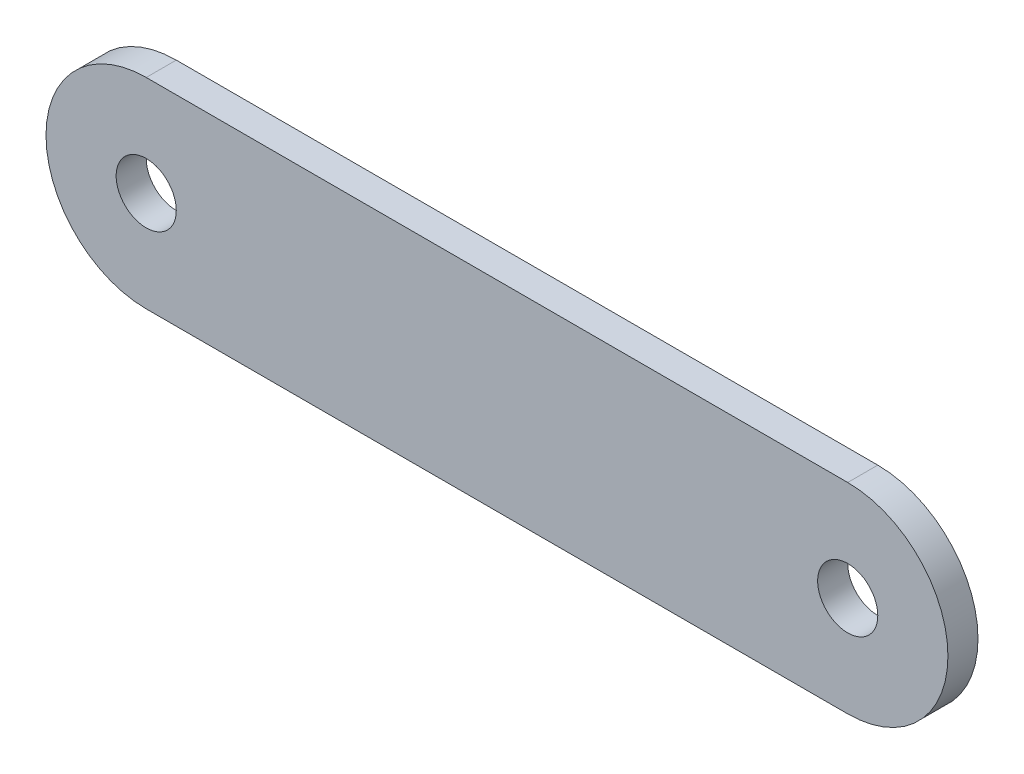
ISO-10303-21;
HEADER;
FILE_DESCRIPTION(('STEP AP214'),'2;1');
FILE_NAME('part.step','',(''),(''),'','','');
FILE_SCHEMA(('AUTOMOTIVE_DESIGN { 1 0 10303 214 1 1 1 1 }'));
ENDSEC;
DATA;
#1=APPLICATION_CONTEXT('core data for automotive mechanical design processes');
#2=APPLICATION_PROTOCOL_DEFINITION('international standard','automotive_design',2000,#1);
#3=PRODUCT_CONTEXT('',#1,'mechanical');
#4=PRODUCT('Part','Part','',(#3));
#5=PRODUCT_RELATED_PRODUCT_CATEGORY('part','',(#4));
#6=PRODUCT_DEFINITION_FORMATION('','',#4);
#7=PRODUCT_DEFINITION_CONTEXT('part definition',#1,'design');
#8=PRODUCT_DEFINITION('design','',#6,#7);
#9=PRODUCT_DEFINITION_SHAPE('','',#8);
#10=(LENGTH_UNIT() NAMED_UNIT(*) SI_UNIT(.MILLI.,.METRE.));
#11=(NAMED_UNIT(*) PLANE_ANGLE_UNIT() SI_UNIT($,.RADIAN.));
#12=(NAMED_UNIT(*) SI_UNIT($,.STERADIAN.) SOLID_ANGLE_UNIT());
#13=UNCERTAINTY_MEASURE_WITH_UNIT(LENGTH_MEASURE(1.E-05),#10,'distance_accuracy_value','');
#14=(GEOMETRIC_REPRESENTATION_CONTEXT(3) GLOBAL_UNCERTAINTY_ASSIGNED_CONTEXT((#13)) GLOBAL_UNIT_ASSIGNED_CONTEXT((#10,
#11,#12)) REPRESENTATION_CONTEXT('',''));
#15=CARTESIAN_POINT('',(0.,0.,0.));
#16=DIRECTION('',(0.,0.,1.));
#17=DIRECTION('',(1.,0.,0.));
#18=AXIS2_PLACEMENT_3D('',#15,#16,#17);
#19=CARTESIAN_POINT('',(0.,0.,3.));
#20=DIRECTION('',(0.,0.,1.));
#21=DIRECTION('',(1.,0.,0.));
#22=AXIS2_PLACEMENT_3D('',#19,#20,#21);
#23=PLANE('',#22);
#24=CARTESIAN_POINT('',(0.,0.,3.));
#25=DIRECTION('',(0.,0.,1.));
#26=DIRECTION('',(1.,0.,0.));
#27=AXIS2_PLACEMENT_3D('',#24,#25,#26);
#28=CIRCLE('',#27,3.);
#29=CARTESIAN_POINT('',(3.,0.,3.));
#30=VERTEX_POINT('',#29);
#31=EDGE_CURVE('E112',#30,#30,#28,.T.);
#32=ORIENTED_EDGE('',*,*,#31,.F.);
#33=EDGE_LOOP('',(#32));
#34=FACE_BOUND('',#33,.T.);
#35=CARTESIAN_POINT('',(0.,0.,3.));
#36=DIRECTION('',(0.,0.,1.));
#37=DIRECTION('',(1.,0.,0.));
#38=AXIS2_PLACEMENT_3D('',#35,#36,#37);
#39=CIRCLE('',#38,10.);
#40=CARTESIAN_POINT('',(0.,10.,3.));
#41=VERTEX_POINT('',#40);
#42=CARTESIAN_POINT('',(0.,-10.,3.));
#43=VERTEX_POINT('',#42);
#44=EDGE_CURVE('E92',#41,#43,#39,.T.);
#45=ORIENTED_EDGE('',*,*,#44,.T.);
#46=DIRECTION('',(1.,0.,0.));
#47=VECTOR('',#46,1.);
#48=CARTESIAN_POINT('',(0.,-10.,3.));
#49=LINE('',#48,#47);
#50=CARTESIAN_POINT('',(70.,-10.,3.));
#51=VERTEX_POINT('',#50);
#52=EDGE_CURVE('E87',#43,#51,#49,.T.);
#53=ORIENTED_EDGE('',*,*,#52,.T.);
#54=CARTESIAN_POINT('',(70.,0.,3.));
#55=DIRECTION('',(0.,0.,1.));
#56=DIRECTION('',(1.,0.,0.));
#57=AXIS2_PLACEMENT_3D('',#54,#55,#56);
#58=CIRCLE('',#57,10.);
#59=CARTESIAN_POINT('',(70.,10.,3.));
#60=VERTEX_POINT('',#59);
#61=EDGE_CURVE('E90',#51,#60,#58,.T.);
#62=ORIENTED_EDGE('',*,*,#61,.T.);
#63=DIRECTION('',(-1.,0.,0.));
#64=VECTOR('',#63,1.);
#65=CARTESIAN_POINT('',(0.,10.,3.));
#66=LINE('',#65,#64);
#67=EDGE_CURVE('E57',#60,#41,#66,.T.);
#68=ORIENTED_EDGE('',*,*,#67,.T.);
#69=EDGE_LOOP('',(#45,#53,#62,#68));
#70=FACE_BOUND('',#69,.T.);
#71=CARTESIAN_POINT('',(70.,0.,3.));
#72=DIRECTION('',(0.,0.,1.));
#73=DIRECTION('',(1.,0.,0.));
#74=AXIS2_PLACEMENT_3D('',#71,#72,#73);
#75=CIRCLE('',#74,3.00000000000001);
#76=CARTESIAN_POINT('',(73.,0.,3.));
#77=VERTEX_POINT('',#76);
#78=EDGE_CURVE('E134',#77,#77,#75,.T.);
#79=ORIENTED_EDGE('',*,*,#78,.F.);
#80=EDGE_LOOP('',(#79));
#81=FACE_BOUND('',#80,.T.);
#82=ADVANCED_FACE('F39',(#34,#70,#81),#23,.T.);
#83=CARTESIAN_POINT('',(0.,0.,0.));
#84=DIRECTION('',(0.,0.,1.));
#85=DIRECTION('',(1.,0.,0.));
#86=AXIS2_PLACEMENT_3D('',#83,#84,#85);
#87=PLANE('',#86);
#88=CARTESIAN_POINT('',(0.,0.,0.));
#89=DIRECTION('',(0.,0.,1.));
#90=DIRECTION('',(1.,0.,0.));
#91=AXIS2_PLACEMENT_3D('',#88,#89,#90);
#92=CIRCLE('',#91,10.);
#93=CARTESIAN_POINT('',(0.,10.,0.));
#94=VERTEX_POINT('',#93);
#95=CARTESIAN_POINT('',(0.,-10.,0.));
#96=VERTEX_POINT('',#95);
#97=EDGE_CURVE('E108',#94,#96,#92,.T.);
#98=ORIENTED_EDGE('',*,*,#97,.F.);
#99=DIRECTION('',(-1.,0.,0.));
#100=VECTOR('',#99,1.);
#101=CARTESIAN_POINT('',(0.,10.,0.));
#102=LINE('',#101,#100);
#103=CARTESIAN_POINT('',(70.,10.,0.));
#104=VERTEX_POINT('',#103);
#105=EDGE_CURVE('E80',#104,#94,#102,.T.);
#106=ORIENTED_EDGE('',*,*,#105,.F.);
#107=CARTESIAN_POINT('',(70.,0.,0.));
#108=DIRECTION('',(0.,0.,1.));
#109=DIRECTION('',(1.,0.,0.));
#110=AXIS2_PLACEMENT_3D('',#107,#108,#109);
#111=CIRCLE('',#110,10.);
#112=CARTESIAN_POINT('',(70.,-10.,0.));
#113=VERTEX_POINT('',#112);
#114=EDGE_CURVE('E74',#113,#104,#111,.T.);
#115=ORIENTED_EDGE('',*,*,#114,.F.);
#116=DIRECTION('',(1.,0.,0.));
#117=VECTOR('',#116,1.);
#118=CARTESIAN_POINT('',(0.,-10.,0.));
#119=LINE('',#118,#117);
#120=EDGE_CURVE('E97',#96,#113,#119,.T.);
#121=ORIENTED_EDGE('',*,*,#120,.F.);
#122=EDGE_LOOP('',(#98,#106,#115,#121));
#123=FACE_BOUND('',#122,.T.);
#124=CARTESIAN_POINT('',(0.,0.,0.));
#125=DIRECTION('',(0.,0.,1.));
#126=DIRECTION('',(1.,0.,0.));
#127=AXIS2_PLACEMENT_3D('',#124,#125,#126);
#128=CIRCLE('',#127,3.);
#129=CARTESIAN_POINT('',(3.,0.,0.));
#130=VERTEX_POINT('',#129);
#131=EDGE_CURVE('E130',#130,#130,#128,.T.);
#132=ORIENTED_EDGE('',*,*,#131,.T.);
#133=EDGE_LOOP('',(#132));
#134=FACE_BOUND('',#133,.T.);
#135=CARTESIAN_POINT('',(70.,0.,0.));
#136=DIRECTION('',(0.,0.,1.));
#137=DIRECTION('',(1.,0.,0.));
#138=AXIS2_PLACEMENT_3D('',#135,#136,#137);
#139=CIRCLE('',#138,3.00000000000001);
#140=CARTESIAN_POINT('',(73.,0.,0.));
#141=VERTEX_POINT('',#140);
#142=EDGE_CURVE('E138',#141,#141,#139,.T.);
#143=ORIENTED_EDGE('',*,*,#142,.T.);
#144=EDGE_LOOP('',(#143));
#145=FACE_BOUND('',#144,.T.);
#146=ADVANCED_FACE('F125',(#123,#134,#145),#87,.F.);
#147=CARTESIAN_POINT('',(0.,0.,3.));
#148=DIRECTION('',(0.,0.,-1.));
#149=DIRECTION('',(-1.,0.,0.));
#150=AXIS2_PLACEMENT_3D('',#147,#148,#149);
#151=CYLINDRICAL_SURFACE('',#150,10.);
#152=ORIENTED_EDGE('',*,*,#97,.T.);
#153=DIRECTION('',(0.,0.,-1.));
#154=VECTOR('',#153,1.);
#155=CARTESIAN_POINT('',(0.,-10.,3.));
#156=LINE('',#155,#154);
#157=EDGE_CURVE('E11',#43,#96,#156,.T.);
#158=ORIENTED_EDGE('',*,*,#157,.F.);
#159=ORIENTED_EDGE('',*,*,#44,.F.);
#160=DIRECTION('',(0.,0.,-1.));
#161=VECTOR('',#160,1.);
#162=CARTESIAN_POINT('',(0.,10.,3.));
#163=LINE('',#162,#161);
#164=EDGE_CURVE('E104',#41,#94,#163,.T.);
#165=ORIENTED_EDGE('',*,*,#164,.T.);
#166=EDGE_LOOP('',(#152,#158,#159,#165));
#167=FACE_BOUND('',#166,.T.);
#168=ADVANCED_FACE('F41',(#167),#151,.T.);
#169=CARTESIAN_POINT('',(0.,-10.,3.));
#170=DIRECTION('',(0.,1.,0.));
#171=DIRECTION('',(0.,0.,1.));
#172=AXIS2_PLACEMENT_3D('',#169,#170,#171);
#173=PLANE('',#172);
#174=ORIENTED_EDGE('',*,*,#120,.T.);
#175=DIRECTION('',(0.,0.,-1.));
#176=VECTOR('',#175,1.);
#177=CARTESIAN_POINT('',(70.,-10.,3.));
#178=LINE('',#177,#176);
#179=EDGE_CURVE('E49',#51,#113,#178,.T.);
#180=ORIENTED_EDGE('',*,*,#179,.F.);
#181=ORIENTED_EDGE('',*,*,#52,.F.);
#182=ORIENTED_EDGE('',*,*,#157,.T.);
#183=EDGE_LOOP('',(#174,#180,#181,#182));
#184=FACE_BOUND('',#183,.T.);
#185=ADVANCED_FACE('F96',(#184),#173,.F.);
#186=CARTESIAN_POINT('',(70.,0.,3.));
#187=DIRECTION('',(0.,0.,-1.));
#188=DIRECTION('',(-1.,0.,0.));
#189=AXIS2_PLACEMENT_3D('',#186,#187,#188);
#190=CYLINDRICAL_SURFACE('',#189,10.);
#191=ORIENTED_EDGE('',*,*,#114,.T.);
#192=DIRECTION('',(0.,0.,-1.));
#193=VECTOR('',#192,1.);
#194=CARTESIAN_POINT('',(70.,10.,3.));
#195=LINE('',#194,#193);
#196=EDGE_CURVE('E99',#60,#104,#195,.T.);
#197=ORIENTED_EDGE('',*,*,#196,.F.);
#198=ORIENTED_EDGE('',*,*,#61,.F.);
#199=ORIENTED_EDGE('',*,*,#179,.T.);
#200=EDGE_LOOP('',(#191,#197,#198,#199));
#201=FACE_BOUND('',#200,.T.);
#202=ADVANCED_FACE('F100',(#201),#190,.T.);
#203=CARTESIAN_POINT('',(0.,10.,3.));
#204=DIRECTION('',(0.,-1.,0.));
#205=DIRECTION('',(0.,0.,-1.));
#206=AXIS2_PLACEMENT_3D('',#203,#204,#205);
#207=PLANE('',#206);
#208=ORIENTED_EDGE('',*,*,#105,.T.);
#209=ORIENTED_EDGE('',*,*,#164,.F.);
#210=ORIENTED_EDGE('',*,*,#67,.F.);
#211=ORIENTED_EDGE('',*,*,#196,.T.);
#212=EDGE_LOOP('',(#208,#209,#210,#211));
#213=FACE_BOUND('',#212,.T.);
#214=ADVANCED_FACE('F122',(#213),#207,.F.);
#215=CARTESIAN_POINT('',(0.,0.,3.));
#216=DIRECTION('',(0.,0.,-1.));
#217=DIRECTION('',(-1.,0.,0.));
#218=AXIS2_PLACEMENT_3D('',#215,#216,#217);
#219=CYLINDRICAL_SURFACE('',#218,3.);
#220=ORIENTED_EDGE('',*,*,#31,.T.);
#221=EDGE_LOOP('',(#220));
#222=FACE_BOUND('',#221,.T.);
#223=ORIENTED_EDGE('',*,*,#131,.F.);
#224=EDGE_LOOP('',(#223));
#225=FACE_BOUND('',#224,.T.);
#226=ADVANCED_FACE('F157',(#222,#225),#219,.F.);
#227=CARTESIAN_POINT('',(70.,0.,3.));
#228=DIRECTION('',(0.,0.,-1.));
#229=DIRECTION('',(-1.,0.,0.));
#230=AXIS2_PLACEMENT_3D('',#227,#228,#229);
#231=CYLINDRICAL_SURFACE('',#230,3.00000000000001);
#232=ORIENTED_EDGE('',*,*,#78,.T.);
#233=EDGE_LOOP('',(#232));
#234=FACE_BOUND('',#233,.T.);
#235=ORIENTED_EDGE('',*,*,#142,.F.);
#236=EDGE_LOOP('',(#235));
#237=FACE_BOUND('',#236,.T.);
#238=ADVANCED_FACE('F146',(#234,#237),#231,.F.);
#239=CLOSED_SHELL('',(#82,#146,#168,#185,#202,#214,#226,#238));
#240=MANIFOLD_SOLID_BREP('B2',#239);
#241=ADVANCED_BREP_SHAPE_REPRESENTATION('',(#18,#240),#14);
#242=SHAPE_DEFINITION_REPRESENTATION(#9,#241);
ENDSEC;
END-ISO-10303-21;
